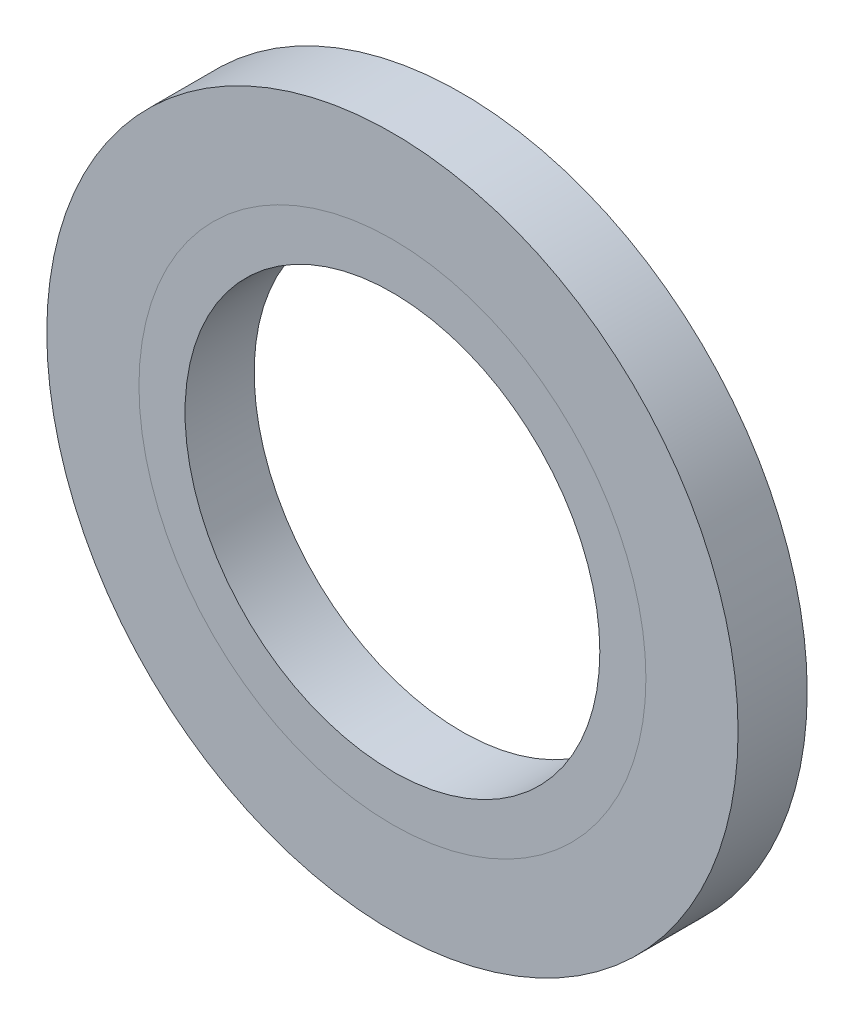
ISO-10303-21;
HEADER;
FILE_DESCRIPTION(('STEP AP214'),'2;1');
FILE_NAME('part.step','',(''),(''),'','','');
FILE_SCHEMA(('AUTOMOTIVE_DESIGN { 1 0 10303 214 1 1 1 1 }'));
ENDSEC;
DATA;
#1=APPLICATION_CONTEXT('core data for automotive mechanical design processes');
#2=APPLICATION_PROTOCOL_DEFINITION('international standard','automotive_design',2000,#1);
#3=PRODUCT_CONTEXT('',#1,'mechanical');
#4=PRODUCT('Part','Part','',(#3));
#5=PRODUCT_RELATED_PRODUCT_CATEGORY('part','',(#4));
#6=PRODUCT_DEFINITION_FORMATION('','',#4);
#7=PRODUCT_DEFINITION_CONTEXT('part definition',#1,'design');
#8=PRODUCT_DEFINITION('design','',#6,#7);
#9=PRODUCT_DEFINITION_SHAPE('','',#8);
#10=(LENGTH_UNIT() NAMED_UNIT(*) SI_UNIT(.MILLI.,.METRE.));
#11=(NAMED_UNIT(*) PLANE_ANGLE_UNIT() SI_UNIT($,.RADIAN.));
#12=(NAMED_UNIT(*) SI_UNIT($,.STERADIAN.) SOLID_ANGLE_UNIT());
#13=UNCERTAINTY_MEASURE_WITH_UNIT(LENGTH_MEASURE(1.E-05),#10,'distance_accuracy_value','');
#14=(GEOMETRIC_REPRESENTATION_CONTEXT(3) GLOBAL_UNCERTAINTY_ASSIGNED_CONTEXT((#13)) GLOBAL_UNIT_ASSIGNED_CONTEXT((#10,
#11,#12)) REPRESENTATION_CONTEXT('',''));
#15=CARTESIAN_POINT('',(0.,0.,0.));
#16=DIRECTION('',(0.,0.,1.));
#17=DIRECTION('',(1.,0.,0.));
#18=AXIS2_PLACEMENT_3D('',#15,#16,#17);
#19=CARTESIAN_POINT('',(0.,0.,0.));
#20=DIRECTION('',(0.,0.,1.));
#21=DIRECTION('',(1.,0.,0.));
#22=AXIS2_PLACEMENT_3D('',#19,#20,#21);
#23=CYLINDRICAL_SURFACE('',#22,11.);
#24=CARTESIAN_POINT('',(0.,0.,0.));
#25=DIRECTION('',(0.,0.,1.));
#26=DIRECTION('',(1.,0.,0.));
#27=AXIS2_PLACEMENT_3D('',#24,#25,#26);
#28=CIRCLE('',#27,11.);
#29=CARTESIAN_POINT('',(11.,0.,0.));
#30=VERTEX_POINT('',#29);
#31=EDGE_CURVE('E57',#30,#30,#28,.F.);
#32=ORIENTED_EDGE('',*,*,#31,.F.);
#33=EDGE_LOOP('',(#32));
#34=FACE_BOUND('',#33,.T.);
#35=CARTESIAN_POINT('',(0.,0.,3.));
#36=DIRECTION('',(0.,0.,1.));
#37=DIRECTION('',(1.,0.,0.));
#38=AXIS2_PLACEMENT_3D('',#35,#36,#37);
#39=CIRCLE('',#38,11.);
#40=CARTESIAN_POINT('',(11.,0.,3.));
#41=VERTEX_POINT('',#40);
#42=EDGE_CURVE('E48',#41,#41,#39,.F.);
#43=ORIENTED_EDGE('',*,*,#42,.T.);
#44=EDGE_LOOP('',(#43));
#45=FACE_BOUND('',#44,.T.);
#46=ADVANCED_FACE('F44',(#34,#45),#23,.T.);
#47=CARTESIAN_POINT('',(0.,0.,3.));
#48=DIRECTION('',(0.,0.,-1.));
#49=DIRECTION('',(-1.,0.,0.));
#50=AXIS2_PLACEMENT_3D('',#47,#48,#49);
#51=CYLINDRICAL_SURFACE('',#50,9.);
#52=CARTESIAN_POINT('',(0.,0.,3.));
#53=DIRECTION('',(0.,0.,1.));
#54=DIRECTION('',(1.,0.,0.));
#55=AXIS2_PLACEMENT_3D('',#52,#53,#54);
#56=CIRCLE('',#55,9.);
#57=CARTESIAN_POINT('',(9.,0.,3.));
#58=VERTEX_POINT('',#57);
#59=EDGE_CURVE('E52',#58,#58,#56,.T.);
#60=ORIENTED_EDGE('',*,*,#59,.T.);
#61=EDGE_LOOP('',(#60));
#62=FACE_BOUND('',#61,.T.);
#63=CARTESIAN_POINT('',(0.,0.,0.));
#64=DIRECTION('',(0.,0.,1.));
#65=DIRECTION('',(1.,0.,0.));
#66=AXIS2_PLACEMENT_3D('',#63,#64,#65);
#67=CIRCLE('',#66,9.);
#68=CARTESIAN_POINT('',(9.,0.,0.));
#69=VERTEX_POINT('',#68);
#70=EDGE_CURVE('E11',#69,#69,#67,.T.);
#71=ORIENTED_EDGE('',*,*,#70,.F.);
#72=EDGE_LOOP('',(#71));
#73=FACE_BOUND('',#72,.T.);
#74=ADVANCED_FACE('F78',(#62,#73),#51,.F.);
#75=CARTESIAN_POINT('',(0.,0.,0.));
#76=DIRECTION('',(0.,0.,1.));
#77=DIRECTION('',(1.,0.,0.));
#78=AXIS2_PLACEMENT_3D('',#75,#76,#77);
#79=PLANE('',#78);
#80=ORIENTED_EDGE('',*,*,#31,.T.);
#81=EDGE_LOOP('',(#80));
#82=FACE_BOUND('',#81,.T.);
#83=ORIENTED_EDGE('',*,*,#70,.T.);
#84=EDGE_LOOP('',(#83));
#85=FACE_BOUND('',#84,.T.);
#86=ADVANCED_FACE('F46',(#82,#85),#79,.F.);
#87=CARTESIAN_POINT('',(0.,0.,3.));
#88=DIRECTION('',(0.,0.,1.));
#89=DIRECTION('',(1.,0.,0.));
#90=AXIS2_PLACEMENT_3D('',#87,#88,#89);
#91=PLANE('',#90);
#92=ORIENTED_EDGE('',*,*,#42,.F.);
#93=EDGE_LOOP('',(#92));
#94=FACE_BOUND('',#93,.T.);
#95=ORIENTED_EDGE('',*,*,#59,.F.);
#96=EDGE_LOOP('',(#95));
#97=FACE_BOUND('',#96,.T.);
#98=ADVANCED_FACE('F73',(#94,#97),#91,.T.);
#99=CLOSED_SHELL('',(#46,#74,#86,#98));
#100=MANIFOLD_SOLID_BREP('B2',#99);
#101=CARTESIAN_POINT('',(0.,0.,0.));
#102=DIRECTION('',(0.,0.,1.));
#103=DIRECTION('',(1.,0.,0.));
#104=AXIS2_PLACEMENT_3D('',#101,#102,#103);
#105=CYLINDRICAL_SURFACE('',#104,11.);
#106=CARTESIAN_POINT('',(0.,0.,3.));
#107=DIRECTION('',(0.,0.,1.));
#108=DIRECTION('',(1.,0.,0.));
#109=AXIS2_PLACEMENT_3D('',#106,#107,#108);
#110=CIRCLE('',#109,11.);
#111=CARTESIAN_POINT('',(11.,0.,3.));
#112=VERTEX_POINT('',#111);
#113=EDGE_CURVE('E151',#112,#112,#110,.F.);
#114=ORIENTED_EDGE('',*,*,#113,.F.);
#115=EDGE_LOOP('',(#114));
#116=FACE_BOUND('',#115,.T.);
#117=CARTESIAN_POINT('',(0.,0.,0.));
#118=DIRECTION('',(0.,0.,1.));
#119=DIRECTION('',(1.,0.,0.));
#120=AXIS2_PLACEMENT_3D('',#117,#118,#119);
#121=CIRCLE('',#120,11.);
#122=CARTESIAN_POINT('',(11.,0.,0.));
#123=VERTEX_POINT('',#122);
#124=EDGE_CURVE('E43',#123,#123,#121,.F.);
#125=ORIENTED_EDGE('',*,*,#124,.T.);
#126=EDGE_LOOP('',(#125));
#127=FACE_BOUND('',#126,.T.);
#128=ADVANCED_FACE('F144',(#116,#127),#105,.F.);
#129=CARTESIAN_POINT('',(0.,0.,3.));
#130=DIRECTION('',(0.,0.,1.));
#131=DIRECTION('',(1.,0.,0.));
#132=AXIS2_PLACEMENT_3D('',#129,#130,#131);
#133=PLANE('',#132);
#134=CARTESIAN_POINT('',(0.,0.,3.));
#135=DIRECTION('',(0.,0.,-1.));
#136=DIRECTION('',(-1.,0.,0.));
#137=AXIS2_PLACEMENT_3D('',#134,#135,#136);
#138=CIRCLE('',#137,15.);
#139=CARTESIAN_POINT('',(-15.,0.,3.));
#140=VERTEX_POINT('',#139);
#141=EDGE_CURVE('E159',#140,#140,#138,.T.);
#142=ORIENTED_EDGE('',*,*,#141,.F.);
#143=EDGE_LOOP('',(#142));
#144=FACE_BOUND('',#143,.T.);
#145=ORIENTED_EDGE('',*,*,#113,.T.);
#146=EDGE_LOOP('',(#145));
#147=FACE_BOUND('',#146,.T.);
#148=ADVANCED_FACE('F181',(#144,#147),#133,.T.);
#149=CARTESIAN_POINT('',(0.,0.,0.));
#150=DIRECTION('',(0.,0.,1.));
#151=DIRECTION('',(1.,0.,0.));
#152=AXIS2_PLACEMENT_3D('',#149,#150,#151);
#153=PLANE('',#152);
#154=CARTESIAN_POINT('',(0.,0.,0.));
#155=DIRECTION('',(0.,0.,-1.));
#156=DIRECTION('',(-1.,0.,0.));
#157=AXIS2_PLACEMENT_3D('',#154,#155,#156);
#158=CIRCLE('',#157,15.);
#159=CARTESIAN_POINT('',(-15.,0.,0.));
#160=VERTEX_POINT('',#159);
#161=EDGE_CURVE('E165',#160,#160,#158,.T.);
#162=ORIENTED_EDGE('',*,*,#161,.T.);
#163=EDGE_LOOP('',(#162));
#164=FACE_BOUND('',#163,.T.);
#165=ORIENTED_EDGE('',*,*,#124,.F.);
#166=EDGE_LOOP('',(#165));
#167=FACE_BOUND('',#166,.T.);
#168=ADVANCED_FACE('F171',(#164,#167),#153,.F.);
#169=CARTESIAN_POINT('',(0.,0.,3.));
#170=DIRECTION('',(0.,0.,-1.));
#171=DIRECTION('',(-1.,0.,0.));
#172=AXIS2_PLACEMENT_3D('',#169,#170,#171);
#173=CYLINDRICAL_SURFACE('',#172,15.);
#174=ORIENTED_EDGE('',*,*,#141,.T.);
#175=EDGE_LOOP('',(#174));
#176=FACE_BOUND('',#175,.T.);
#177=ORIENTED_EDGE('',*,*,#161,.F.);
#178=EDGE_LOOP('',(#177));
#179=FACE_BOUND('',#178,.T.);
#180=ADVANCED_FACE('F174',(#176,#179),#173,.T.);
#181=CLOSED_SHELL('',(#128,#148,#168,#180));
#182=MANIFOLD_SOLID_BREP('B6',#181);
#183=ADVANCED_BREP_SHAPE_REPRESENTATION('',(#18,#100,#182),#14);
#184=SHAPE_DEFINITION_REPRESENTATION(#9,#183);
ENDSEC;
END-ISO-10303-21;
